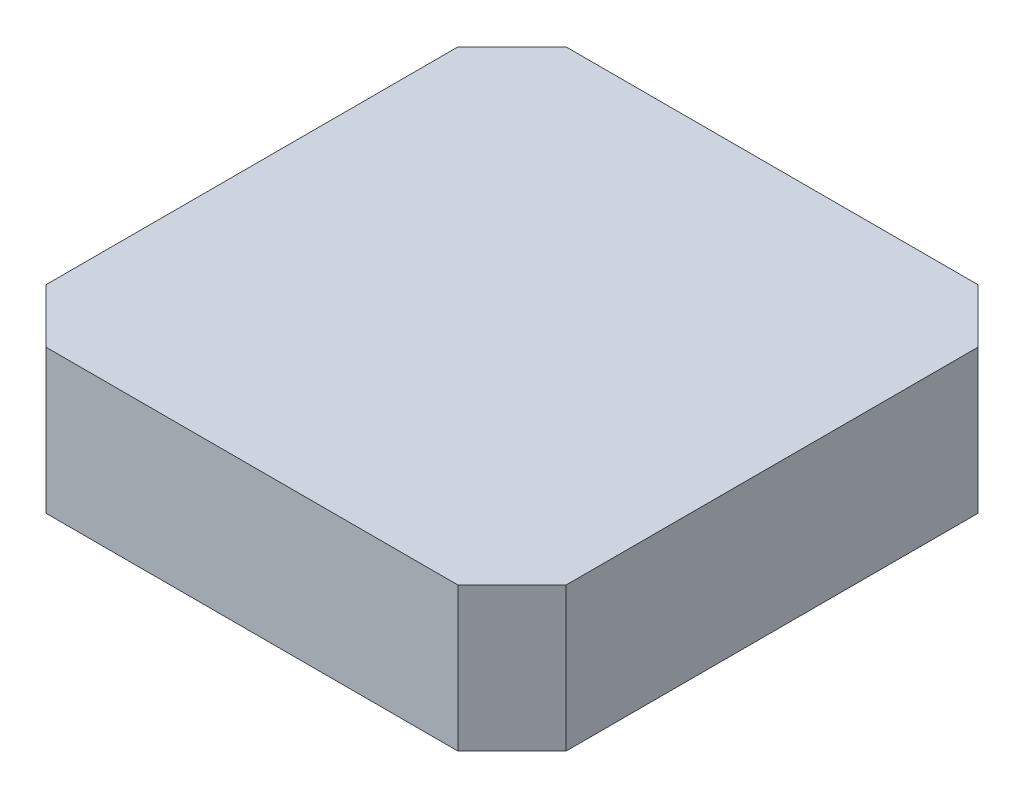
ISO-10303-21;
HEADER;
FILE_DESCRIPTION(('STEP AP214'),'2;1');
FILE_NAME('part.step','',(''),(''),'','','');
FILE_SCHEMA(('AUTOMOTIVE_DESIGN { 1 0 10303 214 1 1 1 1 }'));
ENDSEC;
DATA;
#1=APPLICATION_CONTEXT('core data for automotive mechanical design processes');
#2=APPLICATION_PROTOCOL_DEFINITION('international standard','automotive_design',2000,#1);
#3=PRODUCT_CONTEXT('',#1,'mechanical');
#4=PRODUCT('Part','Part','',(#3));
#5=PRODUCT_RELATED_PRODUCT_CATEGORY('part','',(#4));
#6=PRODUCT_DEFINITION_FORMATION('','',#4);
#7=PRODUCT_DEFINITION_CONTEXT('part definition',#1,'design');
#8=PRODUCT_DEFINITION('design','',#6,#7);
#9=PRODUCT_DEFINITION_SHAPE('','',#8);
#10=(LENGTH_UNIT() NAMED_UNIT(*) SI_UNIT(.MILLI.,.METRE.));
#11=(NAMED_UNIT(*) PLANE_ANGLE_UNIT() SI_UNIT($,.RADIAN.));
#12=(NAMED_UNIT(*) SI_UNIT($,.STERADIAN.) SOLID_ANGLE_UNIT());
#13=UNCERTAINTY_MEASURE_WITH_UNIT(LENGTH_MEASURE(1.E-05),#10,'distance_accuracy_value','');
#14=(GEOMETRIC_REPRESENTATION_CONTEXT(3) GLOBAL_UNCERTAINTY_ASSIGNED_CONTEXT((#13)) GLOBAL_UNIT_ASSIGNED_CONTEXT((#10,
#11,#12)) REPRESENTATION_CONTEXT('',''));
#15=CARTESIAN_POINT('',(0.,0.,0.));
#16=DIRECTION('',(0.,0.,1.));
#17=DIRECTION('',(1.,0.,0.));
#18=AXIS2_PLACEMENT_3D('',#15,#16,#17);
#19=CARTESIAN_POINT('',(-21.15,0.,21.15));
#20=DIRECTION('',(0.,-1.,0.));
#21=DIRECTION('',(0.,0.,-1.));
#22=AXIS2_PLACEMENT_3D('',#19,#20,#21);
#23=PLANE('',#22);
#24=DIRECTION('',(0.,0.,1.));
#25=VECTOR('',#24,1.);
#26=CARTESIAN_POINT('',(21.15,0.,0.));
#27=LINE('',#26,#25);
#28=CARTESIAN_POINT('',(21.15,0.,-16.750923472425));
#29=VERTEX_POINT('',#28);
#30=CARTESIAN_POINT('',(21.15,0.,16.75092347285));
#31=VERTEX_POINT('',#30);
#32=EDGE_CURVE('E127',#29,#31,#27,.T.);
#33=ORIENTED_EDGE('',*,*,#32,.T.);
#34=DIRECTION('',(-0.707106781186548,0.,0.707106781186548));
#35=VECTOR('',#34,1.);
#36=CARTESIAN_POINT('',(18.950461736,0.,18.950461736));
#37=LINE('',#36,#35);
#38=CARTESIAN_POINT('',(16.750923472425,0.,21.15));
#39=VERTEX_POINT('',#38);
#40=EDGE_CURVE('E128',#31,#39,#37,.T.);
#41=ORIENTED_EDGE('',*,*,#40,.T.);
#42=DIRECTION('',(-1.,0.,0.));
#43=VECTOR('',#42,1.);
#44=CARTESIAN_POINT('',(0.,0.,21.15));
#45=LINE('',#44,#43);
#46=CARTESIAN_POINT('',(-16.75092347285,0.,21.15));
#47=VERTEX_POINT('',#46);
#48=EDGE_CURVE('E145',#39,#47,#45,.T.);
#49=ORIENTED_EDGE('',*,*,#48,.T.);
#50=DIRECTION('',(-0.707106781186548,0.,-0.707106781186548));
#51=VECTOR('',#50,1.);
#52=CARTESIAN_POINT('',(-18.950461736,0.,18.950461736));
#53=LINE('',#52,#51);
#54=CARTESIAN_POINT('',(-21.15,0.,16.75092347285));
#55=VERTEX_POINT('',#54);
#56=EDGE_CURVE('E139',#47,#55,#53,.T.);
#57=ORIENTED_EDGE('',*,*,#56,.T.);
#58=DIRECTION('',(0.,0.,-1.));
#59=VECTOR('',#58,1.);
#60=CARTESIAN_POINT('',(-21.15,0.,0.));
#61=LINE('',#60,#59);
#62=CARTESIAN_POINT('',(-21.15,0.,-16.75092347285));
#63=VERTEX_POINT('',#62);
#64=EDGE_CURVE('E99',#55,#63,#61,.T.);
#65=ORIENTED_EDGE('',*,*,#64,.T.);
#66=DIRECTION('',(0.707106781186548,0.,-0.707106781186548));
#67=VECTOR('',#66,1.);
#68=CARTESIAN_POINT('',(-18.950461736,0.,-18.950461736));
#69=LINE('',#68,#67);
#70=CARTESIAN_POINT('',(-16.75092347285,0.,-21.15));
#71=VERTEX_POINT('',#70);
#72=EDGE_CURVE('E66',#63,#71,#69,.T.);
#73=ORIENTED_EDGE('',*,*,#72,.T.);
#74=DIRECTION('',(1.,0.,0.));
#75=VECTOR('',#74,1.);
#76=CARTESIAN_POINT('',(0.,0.,-21.15));
#77=LINE('',#76,#75);
#78=CARTESIAN_POINT('',(16.75092347285,0.,-21.15));
#79=VERTEX_POINT('',#78);
#80=EDGE_CURVE('E89',#71,#79,#77,.T.);
#81=ORIENTED_EDGE('',*,*,#80,.T.);
#82=DIRECTION('',(0.707106781186548,0.,0.707106781186548));
#83=VECTOR('',#82,1.);
#84=CARTESIAN_POINT('',(18.950461736,0.,-18.950461736));
#85=LINE('',#84,#83);
#86=EDGE_CURVE('E102',#79,#29,#85,.T.);
#87=ORIENTED_EDGE('',*,*,#86,.T.);
#88=EDGE_LOOP('',(#33,#41,#49,#57,#65,#73,#81,#87));
#89=FACE_BOUND('',#88,.T.);
#90=ADVANCED_FACE('F17',(#89),#23,.T.);
#91=CARTESIAN_POINT('',(-21.15,0.,-16.750923472));
#92=DIRECTION('',(0.707106781186547,0.,0.707106781186547));
#93=DIRECTION('',(0.707106781186547,0.,-0.707106781186547));
#94=AXIS2_PLACEMENT_3D('',#91,#92,#93);
#95=PLANE('',#94);
#96=DIRECTION('',(0.707106781186547,0.,-0.707106781186547));
#97=VECTOR('',#96,1.);
#98=CARTESIAN_POINT('',(-21.15,11.7,-16.750923472));
#99=LINE('',#98,#97);
#100=CARTESIAN_POINT('',(-21.15,11.7,-16.750923472));
#101=VERTEX_POINT('',#100);
#102=CARTESIAN_POINT('',(-16.750923472,11.7,-21.15));
#103=VERTEX_POINT('',#102);
#104=EDGE_CURVE('E21',#101,#103,#99,.T.);
#105=ORIENTED_EDGE('',*,*,#104,.T.);
#106=DIRECTION('',(0.,-1.,0.));
#107=VECTOR('',#106,1.);
#108=CARTESIAN_POINT('',(-16.750923472,5.85,-21.15));
#109=LINE('',#108,#107);
#110=EDGE_CURVE('E92',#103,#71,#109,.T.);
#111=ORIENTED_EDGE('',*,*,#110,.T.);
#112=ORIENTED_EDGE('',*,*,#72,.F.);
#113=DIRECTION('',(0.,1.,0.));
#114=VECTOR('',#113,1.);
#115=CARTESIAN_POINT('',(-21.15,5.85,-16.750923472));
#116=LINE('',#115,#114);
#117=EDGE_CURVE('E107',#63,#101,#116,.T.);
#118=ORIENTED_EDGE('',*,*,#117,.T.);
#119=EDGE_LOOP('',(#105,#111,#112,#118));
#120=FACE_BOUND('',#119,.T.);
#121=ADVANCED_FACE('F101',(#120),#95,.F.);
#122=CARTESIAN_POINT('',(-16.750923472,0.,-21.15));
#123=DIRECTION('',(0.,0.,1.));
#124=DIRECTION('',(1.,0.,0.));
#125=AXIS2_PLACEMENT_3D('',#122,#123,#124);
#126=PLANE('',#125);
#127=DIRECTION('',(1.,0.,0.));
#128=VECTOR('',#127,1.);
#129=CARTESIAN_POINT('',(0.,11.7,-21.15));
#130=LINE('',#129,#128);
#131=CARTESIAN_POINT('',(16.750923472,11.7,-21.15));
#132=VERTEX_POINT('',#131);
#133=EDGE_CURVE('E117',#103,#132,#130,.T.);
#134=ORIENTED_EDGE('',*,*,#133,.T.);
#135=DIRECTION('',(0.,-1.,0.));
#136=VECTOR('',#135,1.);
#137=CARTESIAN_POINT('',(16.750923472,5.85,-21.15));
#138=LINE('',#137,#136);
#139=EDGE_CURVE('E93',#132,#79,#138,.T.);
#140=ORIENTED_EDGE('',*,*,#139,.T.);
#141=ORIENTED_EDGE('',*,*,#80,.F.);
#142=ORIENTED_EDGE('',*,*,#110,.F.);
#143=EDGE_LOOP('',(#134,#140,#141,#142));
#144=FACE_BOUND('',#143,.T.);
#145=ADVANCED_FACE('F91',(#144),#126,.F.);
#146=CARTESIAN_POINT('',(16.750923472,0.,-21.15));
#147=DIRECTION('',(-0.707106781186547,0.,0.707106781186547));
#148=DIRECTION('',(0.707106781186547,0.,0.707106781186547));
#149=AXIS2_PLACEMENT_3D('',#146,#147,#148);
#150=PLANE('',#149);
#151=DIRECTION('',(0.707106781186547,0.,0.707106781186547));
#152=VECTOR('',#151,1.);
#153=CARTESIAN_POINT('',(16.750923472,11.7,-21.15));
#154=LINE('',#153,#152);
#155=CARTESIAN_POINT('',(21.15,11.7,-16.750923472));
#156=VERTEX_POINT('',#155);
#157=EDGE_CURVE('E115',#132,#156,#154,.T.);
#158=ORIENTED_EDGE('',*,*,#157,.T.);
#159=DIRECTION('',(0.,-1.,0.));
#160=VECTOR('',#159,1.);
#161=CARTESIAN_POINT('',(21.15,5.85,-16.750923472));
#162=LINE('',#161,#160);
#163=EDGE_CURVE('E126',#156,#29,#162,.T.);
#164=ORIENTED_EDGE('',*,*,#163,.T.);
#165=ORIENTED_EDGE('',*,*,#86,.F.);
#166=ORIENTED_EDGE('',*,*,#139,.F.);
#167=EDGE_LOOP('',(#158,#164,#165,#166));
#168=FACE_BOUND('',#167,.T.);
#169=ADVANCED_FACE('F164',(#168),#150,.F.);
#170=CARTESIAN_POINT('',(21.15,0.,-16.750923472));
#171=DIRECTION('',(-1.,0.,0.));
#172=DIRECTION('',(0.,0.,1.));
#173=AXIS2_PLACEMENT_3D('',#170,#171,#172);
#174=PLANE('',#173);
#175=DIRECTION('',(0.,-1.,0.));
#176=VECTOR('',#175,1.);
#177=CARTESIAN_POINT('',(21.15,5.85,16.750923472));
#178=LINE('',#177,#176);
#179=CARTESIAN_POINT('',(21.15,11.7,16.750923472));
#180=VERTEX_POINT('',#179);
#181=EDGE_CURVE('E132',#180,#31,#178,.T.);
#182=ORIENTED_EDGE('',*,*,#181,.T.);
#183=ORIENTED_EDGE('',*,*,#32,.F.);
#184=ORIENTED_EDGE('',*,*,#163,.F.);
#185=DIRECTION('',(0.,0.,1.));
#186=VECTOR('',#185,1.);
#187=CARTESIAN_POINT('',(21.15,11.7,0.));
#188=LINE('',#187,#186);
#189=EDGE_CURVE('E114',#156,#180,#188,.T.);
#190=ORIENTED_EDGE('',*,*,#189,.T.);
#191=EDGE_LOOP('',(#182,#183,#184,#190));
#192=FACE_BOUND('',#191,.T.);
#193=ADVANCED_FACE('F162',(#192),#174,.F.);
#194=CARTESIAN_POINT('',(21.15,0.,16.750923472));
#195=DIRECTION('',(-0.707106781186547,0.,-0.707106781186547));
#196=DIRECTION('',(-0.707106781186547,0.,0.707106781186547));
#197=AXIS2_PLACEMENT_3D('',#194,#195,#196);
#198=PLANE('',#197);
#199=DIRECTION('',(-0.707106781186547,0.,0.707106781186547));
#200=VECTOR('',#199,1.);
#201=CARTESIAN_POINT('',(21.15,11.7,16.750923472));
#202=LINE('',#201,#200);
#203=CARTESIAN_POINT('',(16.750923472,11.7,21.15));
#204=VERTEX_POINT('',#203);
#205=EDGE_CURVE('E112',#180,#204,#202,.T.);
#206=ORIENTED_EDGE('',*,*,#205,.T.);
#207=DIRECTION('',(0.,-1.,0.));
#208=VECTOR('',#207,1.);
#209=CARTESIAN_POINT('',(16.750923472,5.85,21.15));
#210=LINE('',#209,#208);
#211=EDGE_CURVE('E143',#204,#39,#210,.T.);
#212=ORIENTED_EDGE('',*,*,#211,.T.);
#213=ORIENTED_EDGE('',*,*,#40,.F.);
#214=ORIENTED_EDGE('',*,*,#181,.F.);
#215=EDGE_LOOP('',(#206,#212,#213,#214));
#216=FACE_BOUND('',#215,.T.);
#217=ADVANCED_FACE('F160',(#216),#198,.F.);
#218=CARTESIAN_POINT('',(16.750923472,0.,21.15));
#219=DIRECTION('',(0.,0.,-1.));
#220=DIRECTION('',(-1.,0.,0.));
#221=AXIS2_PLACEMENT_3D('',#218,#219,#220);
#222=PLANE('',#221);
#223=DIRECTION('',(0.,-1.,0.));
#224=VECTOR('',#223,1.);
#225=CARTESIAN_POINT('',(-16.750923472,5.85,21.15));
#226=LINE('',#225,#224);
#227=CARTESIAN_POINT('',(-16.750923472,11.7,21.15));
#228=VERTEX_POINT('',#227);
#229=EDGE_CURVE('E136',#228,#47,#226,.T.);
#230=ORIENTED_EDGE('',*,*,#229,.T.);
#231=ORIENTED_EDGE('',*,*,#48,.F.);
#232=ORIENTED_EDGE('',*,*,#211,.F.);
#233=DIRECTION('',(-1.,0.,0.));
#234=VECTOR('',#233,1.);
#235=CARTESIAN_POINT('',(0.,11.7,21.15));
#236=LINE('',#235,#234);
#237=EDGE_CURVE('E111',#204,#228,#236,.T.);
#238=ORIENTED_EDGE('',*,*,#237,.T.);
#239=EDGE_LOOP('',(#230,#231,#232,#238));
#240=FACE_BOUND('',#239,.T.);
#241=ADVANCED_FACE('F157',(#240),#222,.F.);
#242=CARTESIAN_POINT('',(-16.750923472,0.,21.15));
#243=DIRECTION('',(0.707106781186547,0.,-0.707106781186547));
#244=DIRECTION('',(-0.707106781186547,0.,-0.707106781186547));
#245=AXIS2_PLACEMENT_3D('',#242,#243,#244);
#246=PLANE('',#245);
#247=DIRECTION('',(-0.707106781186547,0.,-0.707106781186547));
#248=VECTOR('',#247,1.);
#249=CARTESIAN_POINT('',(-16.750923472,11.7,21.15));
#250=LINE('',#249,#248);
#251=CARTESIAN_POINT('',(-21.15,11.7,16.750923472));
#252=VERTEX_POINT('',#251);
#253=EDGE_CURVE('E27',#228,#252,#250,.T.);
#254=ORIENTED_EDGE('',*,*,#253,.T.);
#255=DIRECTION('',(0.,-1.,0.));
#256=VECTOR('',#255,1.);
#257=CARTESIAN_POINT('',(-21.15,5.85,16.750923472));
#258=LINE('',#257,#256);
#259=EDGE_CURVE('E35',#252,#55,#258,.T.);
#260=ORIENTED_EDGE('',*,*,#259,.T.);
#261=ORIENTED_EDGE('',*,*,#56,.F.);
#262=ORIENTED_EDGE('',*,*,#229,.F.);
#263=EDGE_LOOP('',(#254,#260,#261,#262));
#264=FACE_BOUND('',#263,.T.);
#265=ADVANCED_FACE('F155',(#264),#246,.F.);
#266=CARTESIAN_POINT('',(-21.15,0.,16.750923472));
#267=DIRECTION('',(1.,0.,0.));
#268=DIRECTION('',(0.,0.,-1.));
#269=AXIS2_PLACEMENT_3D('',#266,#267,#268);
#270=PLANE('',#269);
#271=DIRECTION('',(0.,0.,-1.));
#272=VECTOR('',#271,1.);
#273=CARTESIAN_POINT('',(-21.15,11.7,0.));
#274=LINE('',#273,#272);
#275=EDGE_CURVE('E11',#252,#101,#274,.T.);
#276=ORIENTED_EDGE('',*,*,#275,.T.);
#277=ORIENTED_EDGE('',*,*,#117,.F.);
#278=ORIENTED_EDGE('',*,*,#64,.F.);
#279=ORIENTED_EDGE('',*,*,#259,.F.);
#280=EDGE_LOOP('',(#276,#277,#278,#279));
#281=FACE_BOUND('',#280,.T.);
#282=ADVANCED_FACE('F151',(#281),#270,.F.);
#283=CARTESIAN_POINT('',(-21.15,11.7,21.15));
#284=DIRECTION('',(0.,-1.,0.));
#285=DIRECTION('',(0.,0.,-1.));
#286=AXIS2_PLACEMENT_3D('',#283,#284,#285);
#287=PLANE('',#286);
#288=ORIENTED_EDGE('',*,*,#253,.F.);
#289=ORIENTED_EDGE('',*,*,#237,.F.);
#290=ORIENTED_EDGE('',*,*,#205,.F.);
#291=ORIENTED_EDGE('',*,*,#189,.F.);
#292=ORIENTED_EDGE('',*,*,#157,.F.);
#293=ORIENTED_EDGE('',*,*,#133,.F.);
#294=ORIENTED_EDGE('',*,*,#104,.F.);
#295=ORIENTED_EDGE('',*,*,#275,.F.);
#296=EDGE_LOOP('',(#288,#289,#290,#291,#292,#293,#294,#295));
#297=FACE_BOUND('',#296,.T.);
#298=ADVANCED_FACE('F19',(#297),#287,.F.);
#299=CLOSED_SHELL('',(#90,#121,#145,#169,#193,#217,#241,#265,#282,#298));
#300=MANIFOLD_SOLID_BREP('B1',#299);
#301=ADVANCED_BREP_SHAPE_REPRESENTATION('',(#18,#300),#14);
#302=SHAPE_DEFINITION_REPRESENTATION(#9,#301);
ENDSEC;
END-ISO-10303-21;
